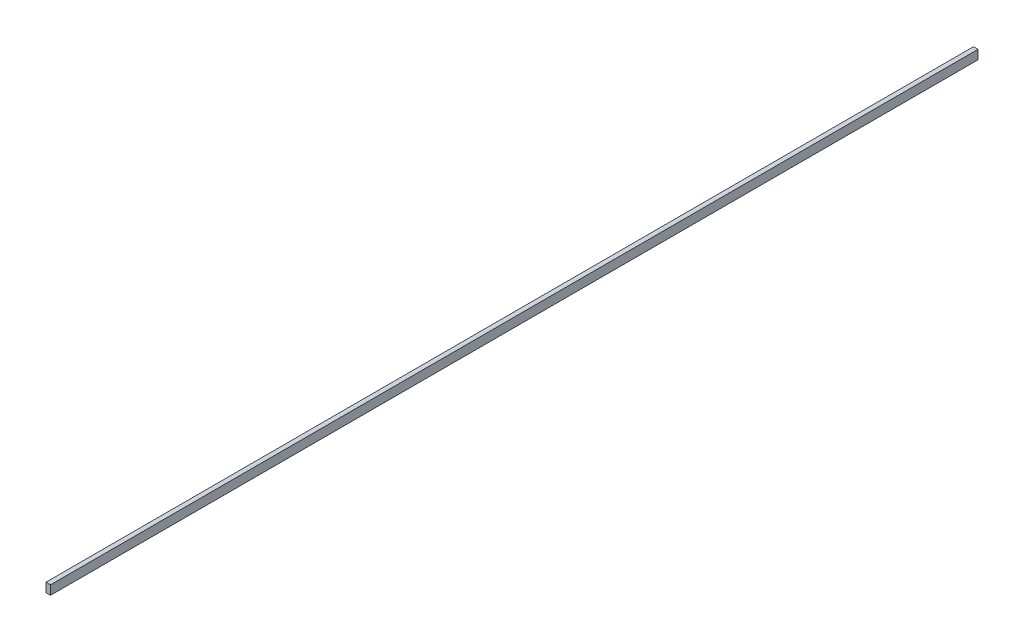
ISO-10303-21;
HEADER;
FILE_DESCRIPTION(('STEP AP214'),'2;1');
FILE_NAME('part.step','',(''),(''),'','','');
FILE_SCHEMA(('AUTOMOTIVE_DESIGN { 1 0 10303 214 1 1 1 1 }'));
ENDSEC;
DATA;
#1=APPLICATION_CONTEXT('core data for automotive mechanical design processes');
#2=APPLICATION_PROTOCOL_DEFINITION('international standard','automotive_design',2000,#1);
#3=PRODUCT_CONTEXT('',#1,'mechanical');
#4=PRODUCT('Part','Part','',(#3));
#5=PRODUCT_RELATED_PRODUCT_CATEGORY('part','',(#4));
#6=PRODUCT_DEFINITION_FORMATION('','',#4);
#7=PRODUCT_DEFINITION_CONTEXT('part definition',#1,'design');
#8=PRODUCT_DEFINITION('design','',#6,#7);
#9=PRODUCT_DEFINITION_SHAPE('','',#8);
#10=(LENGTH_UNIT() NAMED_UNIT(*) SI_UNIT(.MILLI.,.METRE.));
#11=(NAMED_UNIT(*) PLANE_ANGLE_UNIT() SI_UNIT($,.RADIAN.));
#12=(NAMED_UNIT(*) SI_UNIT($,.STERADIAN.) SOLID_ANGLE_UNIT());
#13=UNCERTAINTY_MEASURE_WITH_UNIT(LENGTH_MEASURE(1.E-05),#10,'distance_accuracy_value','');
#14=(GEOMETRIC_REPRESENTATION_CONTEXT(3) GLOBAL_UNCERTAINTY_ASSIGNED_CONTEXT((#13)) GLOBAL_UNIT_ASSIGNED_CONTEXT((#10,
#11,#12)) REPRESENTATION_CONTEXT('',''));
#15=CARTESIAN_POINT('',(0.,0.,0.));
#16=DIRECTION('',(0.,0.,1.));
#17=DIRECTION('',(1.,0.,0.));
#18=AXIS2_PLACEMENT_3D('',#15,#16,#17);
#19=CARTESIAN_POINT('',(5.,10.,1020.));
#20=DIRECTION('',(0.,-1.,0.));
#21=DIRECTION('',(1.,0.,0.));
#22=AXIS2_PLACEMENT_3D('',#19,#20,#21);
#23=PLANE('',#22);
#24=DIRECTION('',(-1.,0.,0.));
#25=VECTOR('',#24,1.);
#26=CARTESIAN_POINT('',(5.,10.,0.));
#27=LINE('',#26,#25);
#28=CARTESIAN_POINT('',(5.,10.,0.));
#29=VERTEX_POINT('',#28);
#30=CARTESIAN_POINT('',(0.,10.,0.));
#31=VERTEX_POINT('',#30);
#32=EDGE_CURVE('E99',#29,#31,#27,.T.);
#33=ORIENTED_EDGE('',*,*,#32,.T.);
#34=DIRECTION('',(0.,0.,-1.));
#35=VECTOR('',#34,1.);
#36=CARTESIAN_POINT('',(0.,10.,1020.));
#37=LINE('',#36,#35);
#38=CARTESIAN_POINT('',(0.,10.,1020.));
#39=VERTEX_POINT('',#38);
#40=EDGE_CURVE('E11',#39,#31,#37,.T.);
#41=ORIENTED_EDGE('',*,*,#40,.F.);
#42=DIRECTION('',(-1.,0.,0.));
#43=VECTOR('',#42,1.);
#44=CARTESIAN_POINT('',(5.,10.,1020.));
#45=LINE('',#44,#43);
#46=CARTESIAN_POINT('',(5.,10.,1020.));
#47=VERTEX_POINT('',#46);
#48=EDGE_CURVE('E85',#47,#39,#45,.T.);
#49=ORIENTED_EDGE('',*,*,#48,.F.);
#50=DIRECTION('',(0.,0.,-1.));
#51=VECTOR('',#50,1.);
#52=CARTESIAN_POINT('',(5.,10.,1020.));
#53=LINE('',#52,#51);
#54=EDGE_CURVE('E95',#47,#29,#53,.T.);
#55=ORIENTED_EDGE('',*,*,#54,.T.);
#56=EDGE_LOOP('',(#33,#41,#49,#55));
#57=FACE_BOUND('',#56,.T.);
#58=ADVANCED_FACE('F35',(#57),#23,.F.);
#59=CARTESIAN_POINT('',(0.,10.,1020.));
#60=DIRECTION('',(1.,0.,0.));
#61=DIRECTION('',(0.,1.,0.));
#62=AXIS2_PLACEMENT_3D('',#59,#60,#61);
#63=PLANE('',#62);
#64=DIRECTION('',(0.,-1.,0.));
#65=VECTOR('',#64,1.);
#66=CARTESIAN_POINT('',(0.,10.,0.));
#67=LINE('',#66,#65);
#68=CARTESIAN_POINT('',(0.,0.,0.));
#69=VERTEX_POINT('',#68);
#70=EDGE_CURVE('E90',#31,#69,#67,.T.);
#71=ORIENTED_EDGE('',*,*,#70,.T.);
#72=DIRECTION('',(0.,0.,-1.));
#73=VECTOR('',#72,1.);
#74=CARTESIAN_POINT('',(0.,0.,1020.));
#75=LINE('',#74,#73);
#76=CARTESIAN_POINT('',(0.,0.,1020.));
#77=VERTEX_POINT('',#76);
#78=EDGE_CURVE('E43',#77,#69,#75,.T.);
#79=ORIENTED_EDGE('',*,*,#78,.F.);
#80=DIRECTION('',(0.,-1.,0.));
#81=VECTOR('',#80,1.);
#82=CARTESIAN_POINT('',(0.,10.,1020.));
#83=LINE('',#82,#81);
#84=EDGE_CURVE('E79',#39,#77,#83,.T.);
#85=ORIENTED_EDGE('',*,*,#84,.F.);
#86=ORIENTED_EDGE('',*,*,#40,.T.);
#87=EDGE_LOOP('',(#71,#79,#85,#86));
#88=FACE_BOUND('',#87,.T.);
#89=ADVANCED_FACE('F89',(#88),#63,.F.);
#90=CARTESIAN_POINT('',(0.,0.,1020.));
#91=DIRECTION('',(0.,1.,0.));
#92=DIRECTION('',(0.,0.,1.));
#93=AXIS2_PLACEMENT_3D('',#90,#91,#92);
#94=PLANE('',#93);
#95=DIRECTION('',(1.,0.,0.));
#96=VECTOR('',#95,1.);
#97=CARTESIAN_POINT('',(0.,0.,0.));
#98=LINE('',#97,#96);
#99=CARTESIAN_POINT('',(5.,0.,0.));
#100=VERTEX_POINT('',#99);
#101=EDGE_CURVE('E103',#69,#100,#98,.T.);
#102=ORIENTED_EDGE('',*,*,#101,.T.);
#103=DIRECTION('',(0.,0.,-1.));
#104=VECTOR('',#103,1.);
#105=CARTESIAN_POINT('',(5.,0.,1020.));
#106=LINE('',#105,#104);
#107=CARTESIAN_POINT('',(5.,0.,1020.));
#108=VERTEX_POINT('',#107);
#109=EDGE_CURVE('E92',#108,#100,#106,.T.);
#110=ORIENTED_EDGE('',*,*,#109,.F.);
#111=DIRECTION('',(1.,0.,0.));
#112=VECTOR('',#111,1.);
#113=CARTESIAN_POINT('',(0.,0.,1020.));
#114=LINE('',#113,#112);
#115=EDGE_CURVE('E82',#77,#108,#114,.T.);
#116=ORIENTED_EDGE('',*,*,#115,.F.);
#117=ORIENTED_EDGE('',*,*,#78,.T.);
#118=EDGE_LOOP('',(#102,#110,#116,#117));
#119=FACE_BOUND('',#118,.T.);
#120=ADVANCED_FACE('F93',(#119),#94,.F.);
#121=CARTESIAN_POINT('',(5.,5.,1020.));
#122=DIRECTION('',(-1.,0.,0.));
#123=DIRECTION('',(0.,0.,1.));
#124=AXIS2_PLACEMENT_3D('',#121,#122,#123);
#125=PLANE('',#124);
#126=DIRECTION('',(0.,1.,0.));
#127=VECTOR('',#126,1.);
#128=CARTESIAN_POINT('',(5.,5.,0.));
#129=LINE('',#128,#127);
#130=EDGE_CURVE('E68',#100,#29,#129,.T.);
#131=ORIENTED_EDGE('',*,*,#130,.T.);
#132=ORIENTED_EDGE('',*,*,#54,.F.);
#133=DIRECTION('',(0.,1.,0.));
#134=VECTOR('',#133,1.);
#135=CARTESIAN_POINT('',(5.,5.,1020.));
#136=LINE('',#135,#134);
#137=EDGE_CURVE('E51',#108,#47,#136,.T.);
#138=ORIENTED_EDGE('',*,*,#137,.F.);
#139=ORIENTED_EDGE('',*,*,#109,.T.);
#140=EDGE_LOOP('',(#131,#132,#138,#139));
#141=FACE_BOUND('',#140,.T.);
#142=ADVANCED_FACE('F107',(#141),#125,.F.);
#143=CARTESIAN_POINT('',(0.,0.,1020.));
#144=DIRECTION('',(0.,0.,1.));
#145=DIRECTION('',(1.,0.,0.));
#146=AXIS2_PLACEMENT_3D('',#143,#144,#145);
#147=PLANE('',#146);
#148=ORIENTED_EDGE('',*,*,#48,.T.);
#149=ORIENTED_EDGE('',*,*,#84,.T.);
#150=ORIENTED_EDGE('',*,*,#115,.T.);
#151=ORIENTED_EDGE('',*,*,#137,.T.);
#152=EDGE_LOOP('',(#148,#149,#150,#151));
#153=FACE_BOUND('',#152,.T.);
#154=ADVANCED_FACE('F80',(#153),#147,.T.);
#155=CARTESIAN_POINT('',(0.,0.,0.));
#156=DIRECTION('',(0.,0.,1.));
#157=DIRECTION('',(1.,0.,0.));
#158=AXIS2_PLACEMENT_3D('',#155,#156,#157);
#159=PLANE('',#158);
#160=ORIENTED_EDGE('',*,*,#32,.F.);
#161=ORIENTED_EDGE('',*,*,#130,.F.);
#162=ORIENTED_EDGE('',*,*,#101,.F.);
#163=ORIENTED_EDGE('',*,*,#70,.F.);
#164=EDGE_LOOP('',(#160,#161,#162,#163));
#165=FACE_BOUND('',#164,.T.);
#166=ADVANCED_FACE('F109',(#165),#159,.F.);
#167=CLOSED_SHELL('',(#58,#89,#120,#142,#154,#166));
#168=MANIFOLD_SOLID_BREP('B2',#167);
#169=ADVANCED_BREP_SHAPE_REPRESENTATION('',(#18,#168),#14);
#170=SHAPE_DEFINITION_REPRESENTATION(#9,#169);
ENDSEC;
END-ISO-10303-21;
